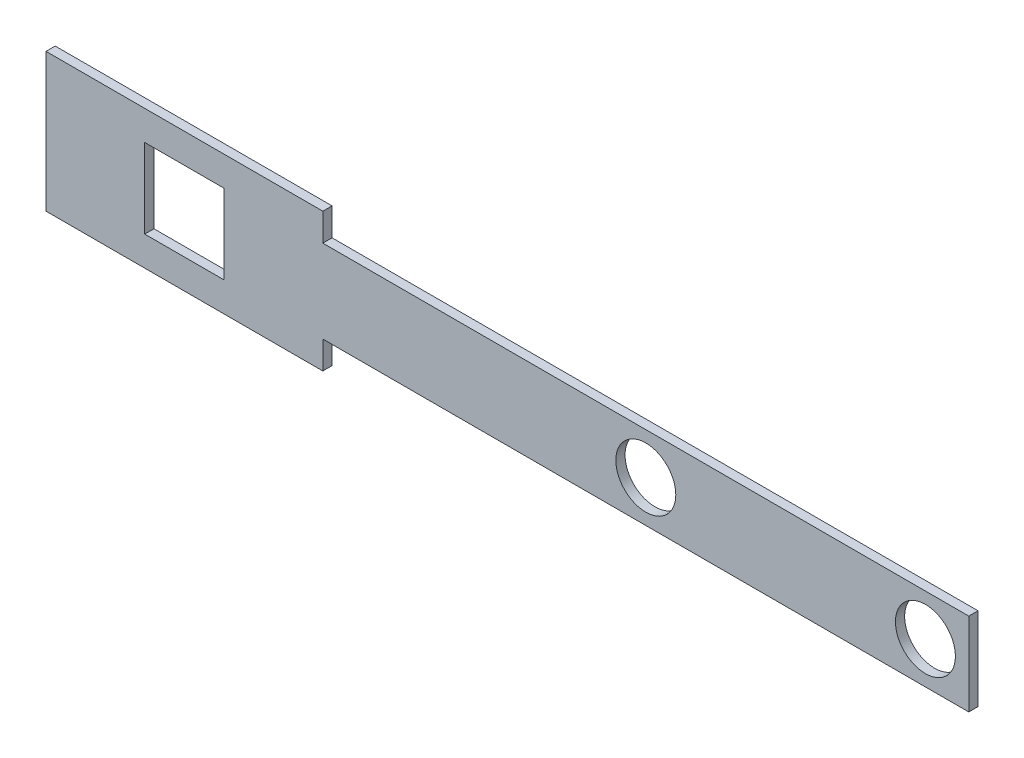
ISO-10303-21;
HEADER;
FILE_DESCRIPTION(('STEP AP214'),'2;1');
FILE_NAME('part.step','',(''),(''),'','','');
FILE_SCHEMA(('AUTOMOTIVE_DESIGN { 1 0 10303 214 1 1 1 1 }'));
ENDSEC;
DATA;
#1=APPLICATION_CONTEXT('core data for automotive mechanical design processes');
#2=APPLICATION_PROTOCOL_DEFINITION('international standard','automotive_design',2000,#1);
#3=PRODUCT_CONTEXT('',#1,'mechanical');
#4=PRODUCT('Part','Part','',(#3));
#5=PRODUCT_RELATED_PRODUCT_CATEGORY('part','',(#4));
#6=PRODUCT_DEFINITION_FORMATION('','',#4);
#7=PRODUCT_DEFINITION_CONTEXT('part definition',#1,'design');
#8=PRODUCT_DEFINITION('design','',#6,#7);
#9=PRODUCT_DEFINITION_SHAPE('','',#8);
#10=(LENGTH_UNIT() NAMED_UNIT(*) SI_UNIT(.MILLI.,.METRE.));
#11=(NAMED_UNIT(*) PLANE_ANGLE_UNIT() SI_UNIT($,.RADIAN.));
#12=(NAMED_UNIT(*) SI_UNIT($,.STERADIAN.) SOLID_ANGLE_UNIT());
#13=UNCERTAINTY_MEASURE_WITH_UNIT(LENGTH_MEASURE(1.E-05),#10,'distance_accuracy_value','');
#14=(GEOMETRIC_REPRESENTATION_CONTEXT(3) GLOBAL_UNCERTAINTY_ASSIGNED_CONTEXT((#13)) GLOBAL_UNIT_ASSIGNED_CONTEXT((#10,
#11,#12)) REPRESENTATION_CONTEXT('',''));
#15=CARTESIAN_POINT('',(0.,0.,0.));
#16=DIRECTION('',(0.,0.,1.));
#17=DIRECTION('',(1.,0.,0.));
#18=AXIS2_PLACEMENT_3D('',#15,#16,#17);
#19=CARTESIAN_POINT('',(0.,0.,1.));
#20=DIRECTION('',(1.,0.,0.));
#21=DIRECTION('',(0.,1.,0.));
#22=AXIS2_PLACEMENT_3D('',#19,#20,#21);
#23=PLANE('',#22);
#24=DIRECTION('',(0.,-1.,0.));
#25=VECTOR('',#24,1.);
#26=CARTESIAN_POINT('',(0.,0.,0.));
#27=LINE('',#26,#25);
#28=CARTESIAN_POINT('',(0.,0.,0.));
#29=VERTEX_POINT('',#28);
#30=CARTESIAN_POINT('',(0.,-15.,0.));
#31=VERTEX_POINT('',#30);
#32=EDGE_CURVE('E157',#29,#31,#27,.T.);
#33=ORIENTED_EDGE('',*,*,#32,.T.);
#34=DIRECTION('',(0.,0.,-1.));
#35=VECTOR('',#34,1.);
#36=CARTESIAN_POINT('',(0.,-15.,1.));
#37=LINE('',#36,#35);
#38=CARTESIAN_POINT('',(0.,-15.,1.));
#39=VERTEX_POINT('',#38);
#40=EDGE_CURVE('E11',#39,#31,#37,.T.);
#41=ORIENTED_EDGE('',*,*,#40,.F.);
#42=DIRECTION('',(0.,-1.,0.));
#43=VECTOR('',#42,1.);
#44=CARTESIAN_POINT('',(0.,0.,1.));
#45=LINE('',#44,#43);
#46=CARTESIAN_POINT('',(0.,0.,1.));
#47=VERTEX_POINT('',#46);
#48=EDGE_CURVE('E161',#47,#39,#45,.T.);
#49=ORIENTED_EDGE('',*,*,#48,.F.);
#50=DIRECTION('',(0.,0.,-1.));
#51=VECTOR('',#50,1.);
#52=CARTESIAN_POINT('',(0.,0.,1.));
#53=LINE('',#52,#51);
#54=EDGE_CURVE('E179',#47,#29,#53,.T.);
#55=ORIENTED_EDGE('',*,*,#54,.T.);
#56=EDGE_LOOP('',(#33,#41,#49,#55));
#57=FACE_BOUND('',#56,.T.);
#58=ADVANCED_FACE('F35',(#57),#23,.F.);
#59=CARTESIAN_POINT('',(0.,-15.,1.));
#60=DIRECTION('',(0.,1.,0.));
#61=DIRECTION('',(0.,0.,1.));
#62=AXIS2_PLACEMENT_3D('',#59,#60,#61);
#63=PLANE('',#62);
#64=DIRECTION('',(1.,0.,0.));
#65=VECTOR('',#64,1.);
#66=CARTESIAN_POINT('',(0.,-15.,0.));
#67=LINE('',#66,#65);
#68=CARTESIAN_POINT('',(30.,-15.,0.));
#69=VERTEX_POINT('',#68);
#70=EDGE_CURVE('E182',#31,#69,#67,.T.);
#71=ORIENTED_EDGE('',*,*,#70,.T.);
#72=DIRECTION('',(0.,0.,-1.));
#73=VECTOR('',#72,1.);
#74=CARTESIAN_POINT('',(30.,-15.,1.));
#75=LINE('',#74,#73);
#76=CARTESIAN_POINT('',(30.,-15.,1.));
#77=VERTEX_POINT('',#76);
#78=EDGE_CURVE('E42',#77,#69,#75,.T.);
#79=ORIENTED_EDGE('',*,*,#78,.F.);
#80=DIRECTION('',(1.,0.,0.));
#81=VECTOR('',#80,1.);
#82=CARTESIAN_POINT('',(0.,-15.,1.));
#83=LINE('',#82,#81);
#84=EDGE_CURVE('E164',#39,#77,#83,.T.);
#85=ORIENTED_EDGE('',*,*,#84,.F.);
#86=ORIENTED_EDGE('',*,*,#40,.T.);
#87=EDGE_LOOP('',(#71,#79,#85,#86));
#88=FACE_BOUND('',#87,.T.);
#89=ADVANCED_FACE('F237',(#88),#63,.F.);
#90=CARTESIAN_POINT('',(30.,-12.,1.));
#91=DIRECTION('',(-1.,0.,0.));
#92=DIRECTION('',(0.,-1.,0.));
#93=AXIS2_PLACEMENT_3D('',#90,#91,#92);
#94=PLANE('',#93);
#95=DIRECTION('',(0.,1.,0.));
#96=VECTOR('',#95,1.);
#97=CARTESIAN_POINT('',(30.,-12.,0.));
#98=LINE('',#97,#96);
#99=CARTESIAN_POINT('',(30.,-12.,0.));
#100=VERTEX_POINT('',#99);
#101=EDGE_CURVE('E184',#69,#100,#98,.T.);
#102=ORIENTED_EDGE('',*,*,#101,.T.);
#103=DIRECTION('',(0.,0.,-1.));
#104=VECTOR('',#103,1.);
#105=CARTESIAN_POINT('',(30.,-12.,1.));
#106=LINE('',#105,#104);
#107=CARTESIAN_POINT('',(30.,-12.,1.));
#108=VERTEX_POINT('',#107);
#109=EDGE_CURVE('E209',#108,#100,#106,.T.);
#110=ORIENTED_EDGE('',*,*,#109,.F.);
#111=DIRECTION('',(0.,1.,0.));
#112=VECTOR('',#111,1.);
#113=CARTESIAN_POINT('',(30.,-12.,1.));
#114=LINE('',#113,#112);
#115=EDGE_CURVE('E167',#77,#108,#114,.T.);
#116=ORIENTED_EDGE('',*,*,#115,.F.);
#117=ORIENTED_EDGE('',*,*,#78,.T.);
#118=EDGE_LOOP('',(#102,#110,#116,#117));
#119=FACE_BOUND('',#118,.T.);
#120=ADVANCED_FACE('F216',(#119),#94,.F.);
#121=CARTESIAN_POINT('',(30.,-12.,1.));
#122=DIRECTION('',(0.,1.,0.));
#123=DIRECTION('',(0.,0.,1.));
#124=AXIS2_PLACEMENT_3D('',#121,#122,#123);
#125=PLANE('',#124);
#126=DIRECTION('',(1.,0.,0.));
#127=VECTOR('',#126,1.);
#128=CARTESIAN_POINT('',(30.,-12.,0.));
#129=LINE('',#128,#127);
#130=CARTESIAN_POINT('',(100.,-12.,0.));
#131=VERTEX_POINT('',#130);
#132=EDGE_CURVE('E186',#100,#131,#129,.T.);
#133=ORIENTED_EDGE('',*,*,#132,.T.);
#134=DIRECTION('',(0.,0.,-1.));
#135=VECTOR('',#134,1.);
#136=CARTESIAN_POINT('',(100.,-12.,1.));
#137=LINE('',#136,#135);
#138=CARTESIAN_POINT('',(100.,-12.,1.));
#139=VERTEX_POINT('',#138);
#140=EDGE_CURVE('E206',#139,#131,#137,.T.);
#141=ORIENTED_EDGE('',*,*,#140,.F.);
#142=DIRECTION('',(1.,0.,0.));
#143=VECTOR('',#142,1.);
#144=CARTESIAN_POINT('',(30.,-12.,1.));
#145=LINE('',#144,#143);
#146=EDGE_CURVE('E169',#108,#139,#145,.T.);
#147=ORIENTED_EDGE('',*,*,#146,.F.);
#148=ORIENTED_EDGE('',*,*,#109,.T.);
#149=EDGE_LOOP('',(#133,#141,#147,#148));
#150=FACE_BOUND('',#149,.T.);
#151=ADVANCED_FACE('F227',(#150),#125,.F.);
#152=CARTESIAN_POINT('',(100.,-3.,1.));
#153=DIRECTION('',(-1.,0.,0.));
#154=DIRECTION('',(0.,0.,1.));
#155=AXIS2_PLACEMENT_3D('',#152,#153,#154);
#156=PLANE('',#155);
#157=DIRECTION('',(0.,1.,0.));
#158=VECTOR('',#157,1.);
#159=CARTESIAN_POINT('',(100.,-3.,0.));
#160=LINE('',#159,#158);
#161=CARTESIAN_POINT('',(100.,-3.,0.));
#162=VERTEX_POINT('',#161);
#163=EDGE_CURVE('E188',#131,#162,#160,.T.);
#164=ORIENTED_EDGE('',*,*,#163,.T.);
#165=DIRECTION('',(0.,0.,-1.));
#166=VECTOR('',#165,1.);
#167=CARTESIAN_POINT('',(100.,-3.,1.));
#168=LINE('',#167,#166);
#169=CARTESIAN_POINT('',(100.,-3.,1.));
#170=VERTEX_POINT('',#169);
#171=EDGE_CURVE('E203',#170,#162,#168,.T.);
#172=ORIENTED_EDGE('',*,*,#171,.F.);
#173=DIRECTION('',(0.,1.,0.));
#174=VECTOR('',#173,1.);
#175=CARTESIAN_POINT('',(100.,-3.,1.));
#176=LINE('',#175,#174);
#177=EDGE_CURVE('E171',#139,#170,#176,.T.);
#178=ORIENTED_EDGE('',*,*,#177,.F.);
#179=ORIENTED_EDGE('',*,*,#140,.T.);
#180=EDGE_LOOP('',(#164,#172,#178,#179));
#181=FACE_BOUND('',#180,.T.);
#182=ADVANCED_FACE('F231',(#181),#156,.F.);
#183=CARTESIAN_POINT('',(30.,-3.,1.));
#184=DIRECTION('',(0.,-1.,0.));
#185=DIRECTION('',(0.,0.,-1.));
#186=AXIS2_PLACEMENT_3D('',#183,#184,#185);
#187=PLANE('',#186);
#188=DIRECTION('',(-1.,0.,0.));
#189=VECTOR('',#188,1.);
#190=CARTESIAN_POINT('',(30.,-3.,0.));
#191=LINE('',#190,#189);
#192=CARTESIAN_POINT('',(30.,-3.,0.));
#193=VERTEX_POINT('',#192);
#194=EDGE_CURVE('E190',#162,#193,#191,.T.);
#195=ORIENTED_EDGE('',*,*,#194,.T.);
#196=DIRECTION('',(0.,0.,-1.));
#197=VECTOR('',#196,1.);
#198=CARTESIAN_POINT('',(30.,-3.,1.));
#199=LINE('',#198,#197);
#200=CARTESIAN_POINT('',(30.,-3.,1.));
#201=VERTEX_POINT('',#200);
#202=EDGE_CURVE('E200',#201,#193,#199,.T.);
#203=ORIENTED_EDGE('',*,*,#202,.F.);
#204=DIRECTION('',(-1.,0.,0.));
#205=VECTOR('',#204,1.);
#206=CARTESIAN_POINT('',(30.,-3.,1.));
#207=LINE('',#206,#205);
#208=EDGE_CURVE('E173',#170,#201,#207,.T.);
#209=ORIENTED_EDGE('',*,*,#208,.F.);
#210=ORIENTED_EDGE('',*,*,#171,.T.);
#211=EDGE_LOOP('',(#195,#203,#209,#210));
#212=FACE_BOUND('',#211,.T.);
#213=ADVANCED_FACE('F250',(#212),#187,.F.);
#214=CARTESIAN_POINT('',(30.,-3.,1.));
#215=DIRECTION('',(-1.,0.,0.));
#216=DIRECTION('',(0.,0.,1.));
#217=AXIS2_PLACEMENT_3D('',#214,#215,#216);
#218=PLANE('',#217);
#219=DIRECTION('',(0.,1.,0.));
#220=VECTOR('',#219,1.);
#221=CARTESIAN_POINT('',(30.,-3.,0.));
#222=LINE('',#221,#220);
#223=CARTESIAN_POINT('',(30.,0.,0.));
#224=VERTEX_POINT('',#223);
#225=EDGE_CURVE('E192',#193,#224,#222,.T.);
#226=ORIENTED_EDGE('',*,*,#225,.T.);
#227=DIRECTION('',(0.,0.,-1.));
#228=VECTOR('',#227,1.);
#229=CARTESIAN_POINT('',(30.,0.,1.));
#230=LINE('',#229,#228);
#231=CARTESIAN_POINT('',(30.,0.,1.));
#232=VERTEX_POINT('',#231);
#233=EDGE_CURVE('E197',#232,#224,#230,.T.);
#234=ORIENTED_EDGE('',*,*,#233,.F.);
#235=DIRECTION('',(0.,1.,0.));
#236=VECTOR('',#235,1.);
#237=CARTESIAN_POINT('',(30.,-3.,1.));
#238=LINE('',#237,#236);
#239=EDGE_CURVE('E175',#201,#232,#238,.T.);
#240=ORIENTED_EDGE('',*,*,#239,.F.);
#241=ORIENTED_EDGE('',*,*,#202,.T.);
#242=EDGE_LOOP('',(#226,#234,#240,#241));
#243=FACE_BOUND('',#242,.T.);
#244=ADVANCED_FACE('F248',(#243),#218,.F.);
#245=CARTESIAN_POINT('',(0.,0.,1.));
#246=DIRECTION('',(0.,-1.,0.));
#247=DIRECTION('',(0.,0.,-1.));
#248=AXIS2_PLACEMENT_3D('',#245,#246,#247);
#249=PLANE('',#248);
#250=DIRECTION('',(-1.,0.,0.));
#251=VECTOR('',#250,1.);
#252=CARTESIAN_POINT('',(0.,0.,0.));
#253=LINE('',#252,#251);
#254=EDGE_CURVE('E165',#224,#29,#253,.T.);
#255=ORIENTED_EDGE('',*,*,#254,.T.);
#256=ORIENTED_EDGE('',*,*,#54,.F.);
#257=DIRECTION('',(-1.,0.,0.));
#258=VECTOR('',#257,1.);
#259=CARTESIAN_POINT('',(0.,0.,1.));
#260=LINE('',#259,#258);
#261=EDGE_CURVE('E177',#232,#47,#260,.T.);
#262=ORIENTED_EDGE('',*,*,#261,.F.);
#263=ORIENTED_EDGE('',*,*,#233,.T.);
#264=EDGE_LOOP('',(#255,#256,#262,#263));
#265=FACE_BOUND('',#264,.T.);
#266=ADVANCED_FACE('F243',(#265),#249,.F.);
#267=CARTESIAN_POINT('',(0.,0.,1.));
#268=DIRECTION('',(0.,0.,1.));
#269=DIRECTION('',(1.,0.,0.));
#270=AXIS2_PLACEMENT_3D('',#267,#268,#269);
#271=PLANE('',#270);
#272=CARTESIAN_POINT('',(95.3,-7.5,1.));
#273=DIRECTION('',(0.,0.,1.));
#274=DIRECTION('',(1.,0.,0.));
#275=AXIS2_PLACEMENT_3D('',#272,#273,#274);
#276=CIRCLE('',#275,3.25000000000004);
#277=CARTESIAN_POINT('',(98.55,-7.5,1.));
#278=VERTEX_POINT('',#277);
#279=EDGE_CURVE('E376',#278,#278,#276,.T.);
#280=ORIENTED_EDGE('',*,*,#279,.F.);
#281=EDGE_LOOP('',(#280));
#282=FACE_BOUND('',#281,.T.);
#283=CARTESIAN_POINT('',(65.,-7.5,1.));
#284=DIRECTION('',(0.,0.,1.));
#285=DIRECTION('',(1.,0.,0.));
#286=AXIS2_PLACEMENT_3D('',#283,#284,#285);
#287=CIRCLE('',#286,3.25000000000004);
#288=CARTESIAN_POINT('',(68.25,-7.5,1.));
#289=VERTEX_POINT('',#288);
#290=EDGE_CURVE('E145',#289,#289,#287,.T.);
#291=ORIENTED_EDGE('',*,*,#290,.F.);
#292=EDGE_LOOP('',(#291));
#293=FACE_BOUND('',#292,.T.);
#294=DIRECTION('',(0.,-1.,0.));
#295=VECTOR('',#294,1.);
#296=CARTESIAN_POINT('',(19.3,-3.2,1.));
#297=LINE('',#296,#295);
#298=CARTESIAN_POINT('',(19.3,-3.2,1.));
#299=VERTEX_POINT('',#298);
#300=CARTESIAN_POINT('',(19.3,-11.8,1.));
#301=VERTEX_POINT('',#300);
#302=EDGE_CURVE('E125',#299,#301,#297,.T.);
#303=ORIENTED_EDGE('',*,*,#302,.T.);
#304=DIRECTION('',(-1.,0.,0.));
#305=VECTOR('',#304,1.);
#306=CARTESIAN_POINT('',(19.3,-11.8,1.));
#307=LINE('',#306,#305);
#308=CARTESIAN_POINT('',(10.7,-11.8,1.));
#309=VERTEX_POINT('',#308);
#310=EDGE_CURVE('E131',#301,#309,#307,.T.);
#311=ORIENTED_EDGE('',*,*,#310,.T.);
#312=DIRECTION('',(0.,-1.,0.));
#313=VECTOR('',#312,1.);
#314=CARTESIAN_POINT('',(10.7,-3.2,1.));
#315=LINE('',#314,#313);
#316=CARTESIAN_POINT('',(10.7,-3.2,1.));
#317=VERTEX_POINT('',#316);
#318=EDGE_CURVE('E135',#317,#309,#315,.T.);
#319=ORIENTED_EDGE('',*,*,#318,.F.);
#320=DIRECTION('',(-1.,0.,0.));
#321=VECTOR('',#320,1.);
#322=CARTESIAN_POINT('',(19.3,-3.2,1.));
#323=LINE('',#322,#321);
#324=EDGE_CURVE('E128',#299,#317,#323,.T.);
#325=ORIENTED_EDGE('',*,*,#324,.F.);
#326=EDGE_LOOP('',(#303,#311,#319,#325));
#327=FACE_BOUND('',#326,.T.);
#328=ORIENTED_EDGE('',*,*,#48,.T.);
#329=ORIENTED_EDGE('',*,*,#84,.T.);
#330=ORIENTED_EDGE('',*,*,#115,.T.);
#331=ORIENTED_EDGE('',*,*,#146,.T.);
#332=ORIENTED_EDGE('',*,*,#177,.T.);
#333=ORIENTED_EDGE('',*,*,#208,.T.);
#334=ORIENTED_EDGE('',*,*,#239,.T.);
#335=ORIENTED_EDGE('',*,*,#261,.T.);
#336=EDGE_LOOP('',(#328,#329,#330,#331,#332,#333,#334,#335));
#337=FACE_BOUND('',#336,.T.);
#338=ADVANCED_FACE('F137',(#282,#293,#327,#337),#271,.T.);
#339=CARTESIAN_POINT('',(0.,0.,0.));
#340=DIRECTION('',(0.,0.,1.));
#341=DIRECTION('',(1.,0.,0.));
#342=AXIS2_PLACEMENT_3D('',#339,#340,#341);
#343=PLANE('',#342);
#344=CARTESIAN_POINT('',(95.3,-7.5,0.));
#345=DIRECTION('',(0.,0.,1.));
#346=DIRECTION('',(1.,0.,0.));
#347=AXIS2_PLACEMENT_3D('',#344,#345,#346);
#348=CIRCLE('',#347,3.25000000000004);
#349=CARTESIAN_POINT('',(98.55,-7.5,0.));
#350=VERTEX_POINT('',#349);
#351=EDGE_CURVE('E379',#350,#350,#348,.T.);
#352=ORIENTED_EDGE('',*,*,#351,.T.);
#353=EDGE_LOOP('',(#352));
#354=FACE_BOUND('',#353,.T.);
#355=CARTESIAN_POINT('',(65.,-7.5,0.));
#356=DIRECTION('',(0.,0.,1.));
#357=DIRECTION('',(1.,0.,0.));
#358=AXIS2_PLACEMENT_3D('',#355,#356,#357);
#359=CIRCLE('',#358,3.25000000000004);
#360=CARTESIAN_POINT('',(68.25,-7.5,0.));
#361=VERTEX_POINT('',#360);
#362=EDGE_CURVE('E381',#361,#361,#359,.T.);
#363=ORIENTED_EDGE('',*,*,#362,.T.);
#364=EDGE_LOOP('',(#363));
#365=FACE_BOUND('',#364,.T.);
#366=DIRECTION('',(-1.,0.,0.));
#367=VECTOR('',#366,1.);
#368=CARTESIAN_POINT('',(19.3,-11.8,0.));
#369=LINE('',#368,#367);
#370=CARTESIAN_POINT('',(19.3,-11.8,0.));
#371=VERTEX_POINT('',#370);
#372=CARTESIAN_POINT('',(10.7,-11.8,0.));
#373=VERTEX_POINT('',#372);
#374=EDGE_CURVE('E151',#371,#373,#369,.T.);
#375=ORIENTED_EDGE('',*,*,#374,.F.);
#376=DIRECTION('',(0.,-1.,0.));
#377=VECTOR('',#376,1.);
#378=CARTESIAN_POINT('',(19.3,-3.2,0.));
#379=LINE('',#378,#377);
#380=CARTESIAN_POINT('',(19.3,-3.2,0.));
#381=VERTEX_POINT('',#380);
#382=EDGE_CURVE('E57',#381,#371,#379,.T.);
#383=ORIENTED_EDGE('',*,*,#382,.F.);
#384=DIRECTION('',(-1.,0.,0.));
#385=VECTOR('',#384,1.);
#386=CARTESIAN_POINT('',(19.3,-3.2,0.));
#387=LINE('',#386,#385);
#388=CARTESIAN_POINT('',(10.7,-3.2,0.));
#389=VERTEX_POINT('',#388);
#390=EDGE_CURVE('E139',#381,#389,#387,.T.);
#391=ORIENTED_EDGE('',*,*,#390,.T.);
#392=DIRECTION('',(0.,-1.,0.));
#393=VECTOR('',#392,1.);
#394=CARTESIAN_POINT('',(10.7,-3.2,0.));
#395=LINE('',#394,#393);
#396=EDGE_CURVE('E142',#389,#373,#395,.T.);
#397=ORIENTED_EDGE('',*,*,#396,.T.);
#398=EDGE_LOOP('',(#375,#383,#391,#397));
#399=FACE_BOUND('',#398,.T.);
#400=ORIENTED_EDGE('',*,*,#32,.F.);
#401=ORIENTED_EDGE('',*,*,#254,.F.);
#402=ORIENTED_EDGE('',*,*,#225,.F.);
#403=ORIENTED_EDGE('',*,*,#194,.F.);
#404=ORIENTED_EDGE('',*,*,#163,.F.);
#405=ORIENTED_EDGE('',*,*,#132,.F.);
#406=ORIENTED_EDGE('',*,*,#101,.F.);
#407=ORIENTED_EDGE('',*,*,#70,.F.);
#408=EDGE_LOOP('',(#400,#401,#402,#403,#404,#405,#406,#407));
#409=FACE_BOUND('',#408,.T.);
#410=ADVANCED_FACE('F222',(#354,#365,#399,#409),#343,.F.);
#411=CARTESIAN_POINT('',(19.3,-3.2,1.));
#412=DIRECTION('',(1.,0.,0.));
#413=DIRECTION('',(0.,0.,-1.));
#414=AXIS2_PLACEMENT_3D('',#411,#412,#413);
#415=PLANE('',#414);
#416=ORIENTED_EDGE('',*,*,#382,.T.);
#417=DIRECTION('',(0.,0.,-1.));
#418=VECTOR('',#417,1.);
#419=CARTESIAN_POINT('',(19.3,-11.8,1.));
#420=LINE('',#419,#418);
#421=EDGE_CURVE('E122',#301,#371,#420,.T.);
#422=ORIENTED_EDGE('',*,*,#421,.F.);
#423=ORIENTED_EDGE('',*,*,#302,.F.);
#424=DIRECTION('',(0.,0.,-1.));
#425=VECTOR('',#424,1.);
#426=CARTESIAN_POINT('',(19.3,-3.2,1.));
#427=LINE('',#426,#425);
#428=EDGE_CURVE('E155',#299,#381,#427,.T.);
#429=ORIENTED_EDGE('',*,*,#428,.T.);
#430=EDGE_LOOP('',(#416,#422,#423,#429));
#431=FACE_BOUND('',#430,.T.);
#432=ADVANCED_FACE('F123',(#431),#415,.F.);
#433=CARTESIAN_POINT('',(19.3,-3.2,1.));
#434=DIRECTION('',(0.,-1.,0.));
#435=DIRECTION('',(0.,0.,-1.));
#436=AXIS2_PLACEMENT_3D('',#433,#434,#435);
#437=PLANE('',#436);
#438=ORIENTED_EDGE('',*,*,#390,.F.);
#439=ORIENTED_EDGE('',*,*,#428,.F.);
#440=ORIENTED_EDGE('',*,*,#324,.T.);
#441=DIRECTION('',(0.,0.,-1.));
#442=VECTOR('',#441,1.);
#443=CARTESIAN_POINT('',(10.7,-3.2,1.));
#444=LINE('',#443,#442);
#445=EDGE_CURVE('E158',#317,#389,#444,.T.);
#446=ORIENTED_EDGE('',*,*,#445,.T.);
#447=EDGE_LOOP('',(#438,#439,#440,#446));
#448=FACE_BOUND('',#447,.T.);
#449=ADVANCED_FACE('F306',(#448),#437,.T.);
#450=CARTESIAN_POINT('',(10.7,-3.2,1.));
#451=DIRECTION('',(1.,0.,0.));
#452=DIRECTION('',(0.,1.,0.));
#453=AXIS2_PLACEMENT_3D('',#450,#451,#452);
#454=PLANE('',#453);
#455=ORIENTED_EDGE('',*,*,#396,.F.);
#456=ORIENTED_EDGE('',*,*,#445,.F.);
#457=ORIENTED_EDGE('',*,*,#318,.T.);
#458=DIRECTION('',(0.,0.,-1.));
#459=VECTOR('',#458,1.);
#460=CARTESIAN_POINT('',(10.7,-11.8,1.));
#461=LINE('',#460,#459);
#462=EDGE_CURVE('E49',#309,#373,#461,.T.);
#463=ORIENTED_EDGE('',*,*,#462,.T.);
#464=EDGE_LOOP('',(#455,#456,#457,#463));
#465=FACE_BOUND('',#464,.T.);
#466=ADVANCED_FACE('F317',(#465),#454,.T.);
#467=CARTESIAN_POINT('',(19.3,-11.8,1.));
#468=DIRECTION('',(0.,-1.,0.));
#469=DIRECTION('',(0.,0.,-1.));
#470=AXIS2_PLACEMENT_3D('',#467,#468,#469);
#471=PLANE('',#470);
#472=ORIENTED_EDGE('',*,*,#374,.T.);
#473=ORIENTED_EDGE('',*,*,#462,.F.);
#474=ORIENTED_EDGE('',*,*,#310,.F.);
#475=ORIENTED_EDGE('',*,*,#421,.T.);
#476=EDGE_LOOP('',(#472,#473,#474,#475));
#477=FACE_BOUND('',#476,.T.);
#478=ADVANCED_FACE('F132',(#477),#471,.F.);
#479=CARTESIAN_POINT('',(65.,-7.5,0.));
#480=DIRECTION('',(0.,0.,1.));
#481=DIRECTION('',(1.,0.,0.));
#482=AXIS2_PLACEMENT_3D('',#479,#480,#481);
#483=CYLINDRICAL_SURFACE('',#482,3.25000000000004);
#484=ORIENTED_EDGE('',*,*,#290,.T.);
#485=EDGE_LOOP('',(#484));
#486=FACE_BOUND('',#485,.T.);
#487=ORIENTED_EDGE('',*,*,#362,.F.);
#488=EDGE_LOOP('',(#487));
#489=FACE_BOUND('',#488,.T.);
#490=ADVANCED_FACE('F336',(#486,#489),#483,.F.);
#491=CARTESIAN_POINT('',(95.3,-7.5,0.));
#492=DIRECTION('',(0.,0.,1.));
#493=DIRECTION('',(1.,0.,0.));
#494=AXIS2_PLACEMENT_3D('',#491,#492,#493);
#495=CYLINDRICAL_SURFACE('',#494,3.25000000000004);
#496=ORIENTED_EDGE('',*,*,#279,.T.);
#497=EDGE_LOOP('',(#496));
#498=FACE_BOUND('',#497,.T.);
#499=ORIENTED_EDGE('',*,*,#351,.F.);
#500=EDGE_LOOP('',(#499));
#501=FACE_BOUND('',#500,.T.);
#502=ADVANCED_FACE('F359',(#498,#501),#495,.F.);
#503=CLOSED_SHELL('',(#58,#89,#120,#151,#182,#213,#244,#266,#338,#410,#432,#449,#466,#478,#490,#502));
#504=MANIFOLD_SOLID_BREP('B2',#503);
#505=ADVANCED_BREP_SHAPE_REPRESENTATION('',(#18,#504),#14);
#506=SHAPE_DEFINITION_REPRESENTATION(#9,#505);
ENDSEC;
END-ISO-10303-21;
